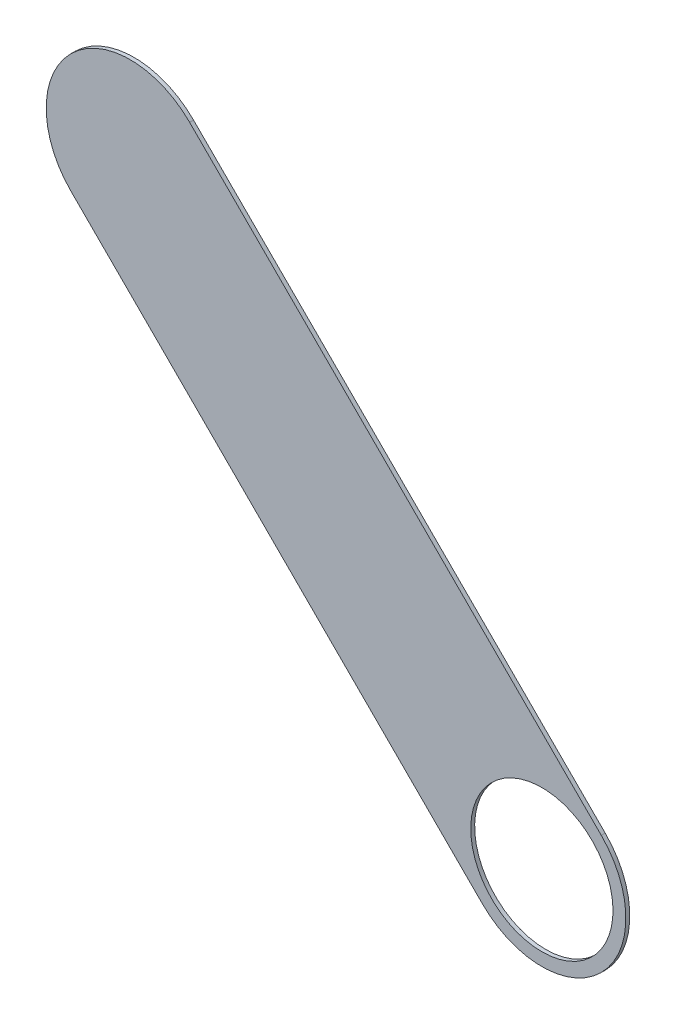
ISO-10303-21;
HEADER;
FILE_DESCRIPTION(('STEP AP214'),'2;1');
FILE_NAME('part.step','',(''),(''),'','','');
FILE_SCHEMA(('AUTOMOTIVE_DESIGN { 1 0 10303 214 1 1 1 1 }'));
ENDSEC;
DATA;
#1=APPLICATION_CONTEXT('core data for automotive mechanical design processes');
#2=APPLICATION_PROTOCOL_DEFINITION('international standard','automotive_design',2000,#1);
#3=PRODUCT_CONTEXT('',#1,'mechanical');
#4=PRODUCT('Part','Part','',(#3));
#5=PRODUCT_RELATED_PRODUCT_CATEGORY('part','',(#4));
#6=PRODUCT_DEFINITION_FORMATION('','',#4);
#7=PRODUCT_DEFINITION_CONTEXT('part definition',#1,'design');
#8=PRODUCT_DEFINITION('design','',#6,#7);
#9=PRODUCT_DEFINITION_SHAPE('','',#8);
#10=(LENGTH_UNIT() NAMED_UNIT(*) SI_UNIT(.MILLI.,.METRE.));
#11=(NAMED_UNIT(*) PLANE_ANGLE_UNIT() SI_UNIT($,.RADIAN.));
#12=(NAMED_UNIT(*) SI_UNIT($,.STERADIAN.) SOLID_ANGLE_UNIT());
#13=UNCERTAINTY_MEASURE_WITH_UNIT(LENGTH_MEASURE(1.E-05),#10,'distance_accuracy_value','');
#14=(GEOMETRIC_REPRESENTATION_CONTEXT(3) GLOBAL_UNCERTAINTY_ASSIGNED_CONTEXT((#13)) GLOBAL_UNIT_ASSIGNED_CONTEXT((#10,
#11,#12)) REPRESENTATION_CONTEXT('',''));
#15=CARTESIAN_POINT('',(0.,0.,0.));
#16=DIRECTION('',(0.,0.,1.));
#17=DIRECTION('',(1.,0.,0.));
#18=AXIS2_PLACEMENT_3D('',#15,#16,#17);
#19=CARTESIAN_POINT('',(-28.25,-7.75,-0.045));
#20=DIRECTION('',(0.,0.,-1.));
#21=DIRECTION('',(0.,-1.,0.));
#22=AXIS2_PLACEMENT_3D('',#19,#20,#21);
#23=CYLINDRICAL_SURFACE('',#22,0.635);
#24=CARTESIAN_POINT('',(-28.25,-7.75,1.6));
#25=DIRECTION('',(0.,0.,-1.));
#26=DIRECTION('',(0.,-1.,0.));
#27=AXIS2_PLACEMENT_3D('',#24,#25,#26);
#28=CIRCLE('',#27,0.635);
#29=CARTESIAN_POINT('',(-28.25,-8.385,1.6));
#30=VERTEX_POINT('',#29);
#31=EDGE_CURVE('E89',#30,#30,#28,.T.);
#32=ORIENTED_EDGE('',*,*,#31,.T.);
#33=DIRECTION('',(0.,0.,1.));
#34=VECTOR('',#33,1.);
#35=CARTESIAN_POINT('',(-28.25,-8.385,-0.045));
#36=LINE('',#35,#34);
#37=CARTESIAN_POINT('',(-28.25,-8.385,1.635));
#38=VERTEX_POINT('',#37);
#39=EDGE_CURVE('E11',#30,#38,#36,.T.);
#40=ORIENTED_EDGE('',*,*,#39,.T.);
#41=CARTESIAN_POINT('',(-28.25,-7.75,1.635));
#42=DIRECTION('',(0.,0.,-1.));
#43=DIRECTION('',(0.,-1.,0.));
#44=AXIS2_PLACEMENT_3D('',#41,#42,#43);
#45=CIRCLE('',#44,0.635);
#46=EDGE_CURVE('E27',#38,#38,#45,.T.);
#47=ORIENTED_EDGE('',*,*,#46,.F.);
#48=ORIENTED_EDGE('',*,*,#39,.F.);
#49=EDGE_LOOP('',(#32,#40,#47,#48));
#50=FACE_BOUND('',#49,.T.);
#51=ADVANCED_FACE('F16',(#50),#23,.F.);
#52=CARTESIAN_POINT('',(-32.45533,-4.60533,1.6));
#53=DIRECTION('',(0.707106781186548,0.707106781186548,0.));
#54=DIRECTION('',(0.,0.,-1.));
#55=AXIS2_PLACEMENT_3D('',#52,#53,#54);
#56=PLANE('',#55);
#57=DIRECTION('',(0.707106781186548,-0.707106781186548,0.));
#58=VECTOR('',#57,1.);
#59=CARTESIAN_POINT('',(-32.45533,-4.60533,1.6));
#60=LINE('',#59,#58);
#61=CARTESIAN_POINT('',(-32.45533,-4.60533,1.6));
#62=VERTEX_POINT('',#61);
#63=CARTESIAN_POINT('',(-28.78033,-8.28033,1.6));
#64=VERTEX_POINT('',#63);
#65=EDGE_CURVE('E20',#62,#64,#60,.T.);
#66=ORIENTED_EDGE('',*,*,#65,.T.);
#67=DIRECTION('',(0.,0.,1.));
#68=VECTOR('',#67,1.);
#69=CARTESIAN_POINT('',(-28.78033,-8.28033,1.6));
#70=LINE('',#69,#68);
#71=CARTESIAN_POINT('',(-28.78033,-8.28033,1.635));
#72=VERTEX_POINT('',#71);
#73=EDGE_CURVE('E102',#64,#72,#70,.T.);
#74=ORIENTED_EDGE('',*,*,#73,.T.);
#75=DIRECTION('',(0.707106781186548,-0.707106781186548,0.));
#76=VECTOR('',#75,1.);
#77=CARTESIAN_POINT('',(-32.45533,-4.60533,1.635));
#78=LINE('',#77,#76);
#79=CARTESIAN_POINT('',(-32.45533,-4.60533,1.635));
#80=VERTEX_POINT('',#79);
#81=EDGE_CURVE('E71',#80,#72,#78,.T.);
#82=ORIENTED_EDGE('',*,*,#81,.F.);
#83=DIRECTION('',(0.,0.,1.));
#84=VECTOR('',#83,1.);
#85=CARTESIAN_POINT('',(-32.45533,-4.60533,1.6));
#86=LINE('',#85,#84);
#87=EDGE_CURVE('E92',#62,#80,#86,.T.);
#88=ORIENTED_EDGE('',*,*,#87,.F.);
#89=EDGE_LOOP('',(#66,#74,#82,#88));
#90=FACE_BOUND('',#89,.T.);
#91=ADVANCED_FACE('F93',(#90),#56,.F.);
#92=CARTESIAN_POINT('',(-27.719669,-7.219669,1.635));
#93=DIRECTION('',(0.,0.,1.));
#94=DIRECTION('',(1.,0.,0.));
#95=AXIS2_PLACEMENT_3D('',#92,#93,#94);
#96=PLANE('',#95);
#97=ORIENTED_EDGE('',*,*,#46,.T.);
#98=EDGE_LOOP('',(#97));
#99=FACE_BOUND('',#98,.T.);
#100=DIRECTION('',(-0.707106781186548,0.707106781186548,0.));
#101=VECTOR('',#100,1.);
#102=CARTESIAN_POINT('',(-27.719669,-7.219669,1.635));
#103=LINE('',#102,#101);
#104=CARTESIAN_POINT('',(-27.719669,-7.219669,1.635));
#105=VERTEX_POINT('',#104);
#106=CARTESIAN_POINT('',(-31.394669,-3.544669,1.635));
#107=VERTEX_POINT('',#106);
#108=EDGE_CURVE('E125',#105,#107,#103,.T.);
#109=ORIENTED_EDGE('',*,*,#108,.T.);
#110=CARTESIAN_POINT('',(-31.9249995,-4.0749995,1.635));
#111=DIRECTION('',(0.,0.,1.));
#112=DIRECTION('',(0.707106781186548,0.707106781186548,0.));
#113=AXIS2_PLACEMENT_3D('',#110,#111,#112);
#114=CIRCLE('',#113,0.75000058564);
#115=EDGE_CURVE('E90',#107,#80,#114,.T.);
#116=ORIENTED_EDGE('',*,*,#115,.T.);
#117=ORIENTED_EDGE('',*,*,#81,.T.);
#118=CARTESIAN_POINT('',(-28.2499995,-7.7499995,1.635));
#119=DIRECTION('',(0.,0.,1.));
#120=DIRECTION('',(-0.707106781186548,-0.707106781186548,0.));
#121=AXIS2_PLACEMENT_3D('',#118,#119,#120);
#122=CIRCLE('',#121,0.75000058564);
#123=EDGE_CURVE('E108',#72,#105,#122,.T.);
#124=ORIENTED_EDGE('',*,*,#123,.T.);
#125=EDGE_LOOP('',(#109,#116,#117,#124));
#126=FACE_BOUND('',#125,.T.);
#127=ADVANCED_FACE('F18',(#99,#126),#96,.T.);
#128=CARTESIAN_POINT('',(-27.719669,-7.219669,1.6));
#129=DIRECTION('',(0.,0.,1.));
#130=DIRECTION('',(1.,0.,0.));
#131=AXIS2_PLACEMENT_3D('',#128,#129,#130);
#132=PLANE('',#131);
#133=ORIENTED_EDGE('',*,*,#31,.F.);
#134=EDGE_LOOP('',(#133));
#135=FACE_BOUND('',#134,.T.);
#136=CARTESIAN_POINT('',(-28.2499995,-7.7499995,1.6));
#137=DIRECTION('',(0.,0.,1.));
#138=DIRECTION('',(-0.707106781186548,-0.707106781186548,0.));
#139=AXIS2_PLACEMENT_3D('',#136,#137,#138);
#140=CIRCLE('',#139,0.75000058564);
#141=CARTESIAN_POINT('',(-27.719669,-7.219669,1.6));
#142=VERTEX_POINT('',#141);
#143=EDGE_CURVE('E85',#64,#142,#140,.T.);
#144=ORIENTED_EDGE('',*,*,#143,.F.);
#145=ORIENTED_EDGE('',*,*,#65,.F.);
#146=CARTESIAN_POINT('',(-31.9249995,-4.0749995,1.6));
#147=DIRECTION('',(0.,0.,1.));
#148=DIRECTION('',(0.707106781186548,0.707106781186548,0.));
#149=AXIS2_PLACEMENT_3D('',#146,#147,#148);
#150=CIRCLE('',#149,0.75000058564);
#151=CARTESIAN_POINT('',(-31.394669,-3.544669,1.6));
#152=VERTEX_POINT('',#151);
#153=EDGE_CURVE('E83',#152,#62,#150,.T.);
#154=ORIENTED_EDGE('',*,*,#153,.F.);
#155=DIRECTION('',(-0.707106781186548,0.707106781186548,0.));
#156=VECTOR('',#155,1.);
#157=CARTESIAN_POINT('',(-27.719669,-7.219669,1.6));
#158=LINE('',#157,#156);
#159=EDGE_CURVE('E118',#142,#152,#158,.T.);
#160=ORIENTED_EDGE('',*,*,#159,.F.);
#161=EDGE_LOOP('',(#144,#145,#154,#160));
#162=FACE_BOUND('',#161,.T.);
#163=ADVANCED_FACE('F80',(#135,#162),#132,.F.);
#164=CARTESIAN_POINT('',(-31.9249995,-4.0749995,1.6));
#165=DIRECTION('',(0.,0.,-1.));
#166=DIRECTION('',(0.707106781186548,0.707106781186548,0.));
#167=AXIS2_PLACEMENT_3D('',#164,#165,#166);
#168=CYLINDRICAL_SURFACE('',#167,0.75000058564);
#169=ORIENTED_EDGE('',*,*,#153,.T.);
#170=ORIENTED_EDGE('',*,*,#87,.T.);
#171=ORIENTED_EDGE('',*,*,#115,.F.);
#172=DIRECTION('',(0.,0.,1.));
#173=VECTOR('',#172,1.);
#174=CARTESIAN_POINT('',(-31.394669,-3.544669,1.6));
#175=LINE('',#174,#173);
#176=EDGE_CURVE('E99',#152,#107,#175,.T.);
#177=ORIENTED_EDGE('',*,*,#176,.F.);
#178=EDGE_LOOP('',(#169,#170,#171,#177));
#179=FACE_BOUND('',#178,.T.);
#180=ADVANCED_FACE('F97',(#179),#168,.T.);
#181=CARTESIAN_POINT('',(-28.2499995,-7.7499995,1.6));
#182=DIRECTION('',(0.,0.,-1.));
#183=DIRECTION('',(-0.707106781186548,-0.707106781186548,0.));
#184=AXIS2_PLACEMENT_3D('',#181,#182,#183);
#185=CYLINDRICAL_SURFACE('',#184,0.75000058564);
#186=ORIENTED_EDGE('',*,*,#143,.T.);
#187=DIRECTION('',(0.,0.,1.));
#188=VECTOR('',#187,1.);
#189=CARTESIAN_POINT('',(-27.719669,-7.219669,1.6));
#190=LINE('',#189,#188);
#191=EDGE_CURVE('E131',#142,#105,#190,.T.);
#192=ORIENTED_EDGE('',*,*,#191,.T.);
#193=ORIENTED_EDGE('',*,*,#123,.F.);
#194=ORIENTED_EDGE('',*,*,#73,.F.);
#195=EDGE_LOOP('',(#186,#192,#193,#194));
#196=FACE_BOUND('',#195,.T.);
#197=ADVANCED_FACE('F160',(#196),#185,.T.);
#198=CARTESIAN_POINT('',(-27.719669,-7.219669,1.6));
#199=DIRECTION('',(-0.707106781186548,-0.707106781186548,0.));
#200=DIRECTION('',(-0.707106781186548,0.707106781186548,0.));
#201=AXIS2_PLACEMENT_3D('',#198,#199,#200);
#202=PLANE('',#201);
#203=ORIENTED_EDGE('',*,*,#159,.T.);
#204=ORIENTED_EDGE('',*,*,#176,.T.);
#205=ORIENTED_EDGE('',*,*,#108,.F.);
#206=ORIENTED_EDGE('',*,*,#191,.F.);
#207=EDGE_LOOP('',(#203,#204,#205,#206));
#208=FACE_BOUND('',#207,.T.);
#209=ADVANCED_FACE('F170',(#208),#202,.F.);
#210=CLOSED_SHELL('',(#51,#91,#127,#163,#180,#197,#209));
#211=MANIFOLD_SOLID_BREP('B1',#210);
#212=ADVANCED_BREP_SHAPE_REPRESENTATION('',(#18,#211),#14);
#213=SHAPE_DEFINITION_REPRESENTATION(#9,#212);
ENDSEC;
END-ISO-10303-21;
